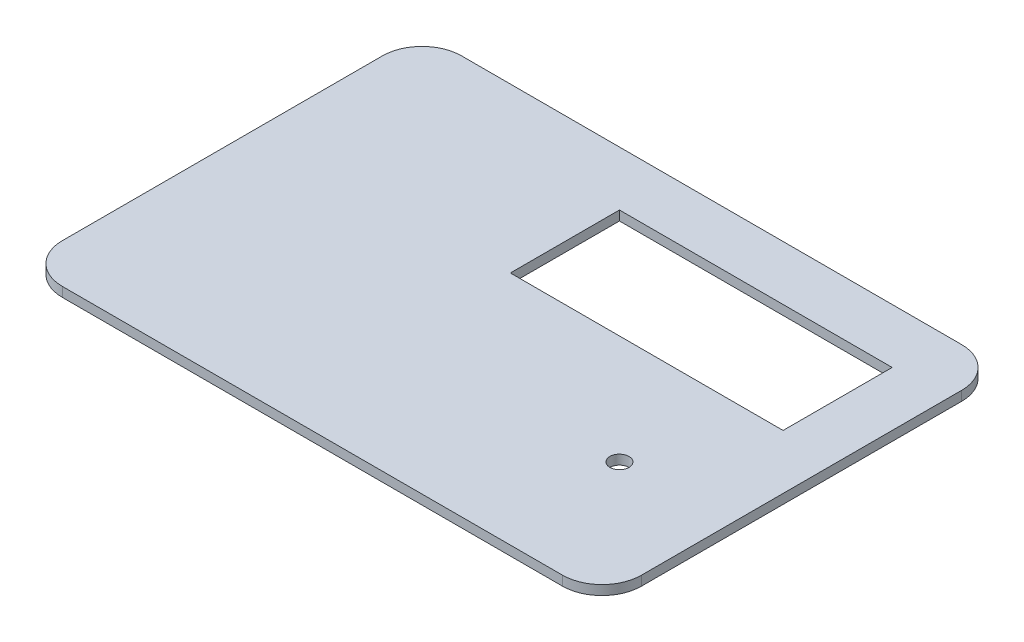
ISO-10303-21;
HEADER;
FILE_DESCRIPTION(('STEP AP214'),'2;1');
FILE_NAME('part.step','',(''),(''),'','','');
FILE_SCHEMA(('AUTOMOTIVE_DESIGN { 1 0 10303 214 1 1 1 1 }'));
ENDSEC;
DATA;
#1=APPLICATION_CONTEXT('core data for automotive mechanical design processes');
#2=APPLICATION_PROTOCOL_DEFINITION('international standard','automotive_design',2000,#1);
#3=PRODUCT_CONTEXT('',#1,'mechanical');
#4=PRODUCT('Part','Part','',(#3));
#5=PRODUCT_RELATED_PRODUCT_CATEGORY('part','',(#4));
#6=PRODUCT_DEFINITION_FORMATION('','',#4);
#7=PRODUCT_DEFINITION_CONTEXT('part definition',#1,'design');
#8=PRODUCT_DEFINITION('design','',#6,#7);
#9=PRODUCT_DEFINITION_SHAPE('','',#8);
#10=(LENGTH_UNIT() NAMED_UNIT(*) SI_UNIT(.MILLI.,.METRE.));
#11=(NAMED_UNIT(*) PLANE_ANGLE_UNIT() SI_UNIT($,.RADIAN.));
#12=(NAMED_UNIT(*) SI_UNIT($,.STERADIAN.) SOLID_ANGLE_UNIT());
#13=UNCERTAINTY_MEASURE_WITH_UNIT(LENGTH_MEASURE(1.E-05),#10,'distance_accuracy_value','');
#14=(GEOMETRIC_REPRESENTATION_CONTEXT(3) GLOBAL_UNCERTAINTY_ASSIGNED_CONTEXT((#13)) GLOBAL_UNIT_ASSIGNED_CONTEXT((#10,
#11,#12)) REPRESENTATION_CONTEXT('',''));
#15=CARTESIAN_POINT('',(0.,0.,0.));
#16=DIRECTION('',(0.,0.,1.));
#17=DIRECTION('',(1.,0.,0.));
#18=AXIS2_PLACEMENT_3D('',#15,#16,#17);
#19=CARTESIAN_POINT('',(91.7,3.5,58.7000000000001));
#20=DIRECTION('',(0.,-1.,0.));
#21=DIRECTION('',(0.,0.,-1.));
#22=AXIS2_PLACEMENT_3D('',#19,#20,#21);
#23=CYLINDRICAL_SURFACE('',#22,14.5);
#24=CARTESIAN_POINT('',(91.7,0.,58.7000000000001));
#25=DIRECTION('',(0.,1.,0.));
#26=DIRECTION('',(0.,0.,1.));
#27=AXIS2_PLACEMENT_3D('',#24,#25,#26);
#28=CIRCLE('',#27,14.5);
#29=CARTESIAN_POINT('',(91.6999999999999,0.,73.2000000000001));
#30=VERTEX_POINT('',#29);
#31=CARTESIAN_POINT('',(106.2,0.,58.7));
#32=VERTEX_POINT('',#31);
#33=EDGE_CURVE('E159',#30,#32,#28,.T.);
#34=ORIENTED_EDGE('',*,*,#33,.T.);
#35=DIRECTION('',(0.,-1.,0.));
#36=VECTOR('',#35,1.);
#37=CARTESIAN_POINT('',(106.2,3.5,58.7));
#38=LINE('',#37,#36);
#39=CARTESIAN_POINT('',(106.2,3.5,58.7));
#40=VERTEX_POINT('',#39);
#41=EDGE_CURVE('E11',#40,#32,#38,.T.);
#42=ORIENTED_EDGE('',*,*,#41,.F.);
#43=CARTESIAN_POINT('',(91.7,3.5,58.7000000000001));
#44=DIRECTION('',(0.,1.,0.));
#45=DIRECTION('',(0.,0.,1.));
#46=AXIS2_PLACEMENT_3D('',#43,#44,#45);
#47=CIRCLE('',#46,14.5);
#48=CARTESIAN_POINT('',(91.6999999999999,3.5,73.2000000000001));
#49=VERTEX_POINT('',#48);
#50=EDGE_CURVE('E168',#49,#40,#47,.T.);
#51=ORIENTED_EDGE('',*,*,#50,.F.);
#52=DIRECTION('',(0.,-1.,0.));
#53=VECTOR('',#52,1.);
#54=CARTESIAN_POINT('',(91.6999999999999,3.5,73.2000000000001));
#55=LINE('',#54,#53);
#56=EDGE_CURVE('E186',#49,#30,#55,.T.);
#57=ORIENTED_EDGE('',*,*,#56,.T.);
#58=EDGE_LOOP('',(#34,#42,#51,#57));
#59=FACE_BOUND('',#58,.T.);
#60=ADVANCED_FACE('F37',(#59),#23,.T.);
#61=CARTESIAN_POINT('',(106.2,3.5,-58.6999999999998));
#62=DIRECTION('',(-1.,0.,0.));
#63=DIRECTION('',(0.,0.,1.));
#64=AXIS2_PLACEMENT_3D('',#61,#62,#63);
#65=PLANE('',#64);
#66=DIRECTION('',(0.,0.,-1.));
#67=VECTOR('',#66,1.);
#68=CARTESIAN_POINT('',(106.2,0.,-58.6999999999998));
#69=LINE('',#68,#67);
#70=CARTESIAN_POINT('',(106.2,0.,-58.6999999999998));
#71=VERTEX_POINT('',#70);
#72=EDGE_CURVE('E189',#32,#71,#69,.T.);
#73=ORIENTED_EDGE('',*,*,#72,.T.);
#74=DIRECTION('',(0.,-1.,0.));
#75=VECTOR('',#74,1.);
#76=CARTESIAN_POINT('',(106.2,3.5,-58.6999999999998));
#77=LINE('',#76,#75);
#78=CARTESIAN_POINT('',(106.2,3.5,-58.6999999999998));
#79=VERTEX_POINT('',#78);
#80=EDGE_CURVE('E44',#79,#71,#77,.T.);
#81=ORIENTED_EDGE('',*,*,#80,.F.);
#82=DIRECTION('',(0.,0.,-1.));
#83=VECTOR('',#82,1.);
#84=CARTESIAN_POINT('',(106.2,3.5,-58.6999999999998));
#85=LINE('',#84,#83);
#86=EDGE_CURVE('E171',#40,#79,#85,.T.);
#87=ORIENTED_EDGE('',*,*,#86,.F.);
#88=ORIENTED_EDGE('',*,*,#41,.T.);
#89=EDGE_LOOP('',(#73,#81,#87,#88));
#90=FACE_BOUND('',#89,.T.);
#91=ADVANCED_FACE('F245',(#90),#65,.F.);
#92=CARTESIAN_POINT('',(91.7,3.5,-58.6999999999999));
#93=DIRECTION('',(0.,-1.,0.));
#94=DIRECTION('',(0.,0.,-1.));
#95=AXIS2_PLACEMENT_3D('',#92,#93,#94);
#96=CYLINDRICAL_SURFACE('',#95,14.5);
#97=CARTESIAN_POINT('',(91.7,0.,-58.6999999999999));
#98=DIRECTION('',(0.,1.,0.));
#99=DIRECTION('',(0.,0.,1.));
#100=AXIS2_PLACEMENT_3D('',#97,#98,#99);
#101=CIRCLE('',#100,14.5);
#102=CARTESIAN_POINT('',(91.6999999999999,0.,-73.1999999999999));
#103=VERTEX_POINT('',#102);
#104=EDGE_CURVE('E191',#71,#103,#101,.T.);
#105=ORIENTED_EDGE('',*,*,#104,.T.);
#106=DIRECTION('',(0.,-1.,0.));
#107=VECTOR('',#106,1.);
#108=CARTESIAN_POINT('',(91.6999999999999,3.5,-73.1999999999999));
#109=LINE('',#108,#107);
#110=CARTESIAN_POINT('',(91.6999999999999,3.5,-73.1999999999999));
#111=VERTEX_POINT('',#110);
#112=EDGE_CURVE('E216',#111,#103,#109,.T.);
#113=ORIENTED_EDGE('',*,*,#112,.F.);
#114=CARTESIAN_POINT('',(91.7,3.5,-58.6999999999999));
#115=DIRECTION('',(0.,1.,0.));
#116=DIRECTION('',(0.,0.,1.));
#117=AXIS2_PLACEMENT_3D('',#114,#115,#116);
#118=CIRCLE('',#117,14.5);
#119=EDGE_CURVE('E174',#79,#111,#118,.T.);
#120=ORIENTED_EDGE('',*,*,#119,.F.);
#121=ORIENTED_EDGE('',*,*,#80,.T.);
#122=EDGE_LOOP('',(#105,#113,#120,#121));
#123=FACE_BOUND('',#122,.T.);
#124=ADVANCED_FACE('F223',(#123),#96,.T.);
#125=CARTESIAN_POINT('',(-91.6999999999999,3.5,-73.1999999999999));
#126=DIRECTION('',(0.,0.,1.));
#127=DIRECTION('',(1.,0.,0.));
#128=AXIS2_PLACEMENT_3D('',#125,#126,#127);
#129=PLANE('',#128);
#130=DIRECTION('',(-1.,0.,0.));
#131=VECTOR('',#130,1.);
#132=CARTESIAN_POINT('',(-91.6999999999999,0.,-73.1999999999999));
#133=LINE('',#132,#131);
#134=CARTESIAN_POINT('',(-91.7,0.,-73.1999999999999));
#135=VERTEX_POINT('',#134);
#136=EDGE_CURVE('E193',#103,#135,#133,.T.);
#137=ORIENTED_EDGE('',*,*,#136,.T.);
#138=DIRECTION('',(0.,-1.,0.));
#139=VECTOR('',#138,1.);
#140=CARTESIAN_POINT('',(-91.7,3.5,-73.1999999999999));
#141=LINE('',#140,#139);
#142=CARTESIAN_POINT('',(-91.7,3.5,-73.1999999999999));
#143=VERTEX_POINT('',#142);
#144=EDGE_CURVE('E213',#143,#135,#141,.T.);
#145=ORIENTED_EDGE('',*,*,#144,.F.);
#146=DIRECTION('',(-1.,0.,0.));
#147=VECTOR('',#146,1.);
#148=CARTESIAN_POINT('',(-91.6999999999999,3.5,-73.1999999999999));
#149=LINE('',#148,#147);
#150=EDGE_CURVE('E176',#111,#143,#149,.T.);
#151=ORIENTED_EDGE('',*,*,#150,.F.);
#152=ORIENTED_EDGE('',*,*,#112,.T.);
#153=EDGE_LOOP('',(#137,#145,#151,#152));
#154=FACE_BOUND('',#153,.T.);
#155=ADVANCED_FACE('F233',(#154),#129,.F.);
#156=CARTESIAN_POINT('',(-91.7,3.5,-58.6999999999999));
#157=DIRECTION('',(0.,-1.,0.));
#158=DIRECTION('',(0.,0.,-1.));
#159=AXIS2_PLACEMENT_3D('',#156,#157,#158);
#160=CYLINDRICAL_SURFACE('',#159,14.5);
#161=CARTESIAN_POINT('',(-91.7,0.,-58.6999999999999));
#162=DIRECTION('',(0.,1.,0.));
#163=DIRECTION('',(0.,0.,-1.));
#164=AXIS2_PLACEMENT_3D('',#161,#162,#163);
#165=CIRCLE('',#164,14.5);
#166=CARTESIAN_POINT('',(-106.2,0.,-58.6999999999998));
#167=VERTEX_POINT('',#166);
#168=EDGE_CURVE('E195',#135,#167,#165,.T.);
#169=ORIENTED_EDGE('',*,*,#168,.T.);
#170=DIRECTION('',(0.,-1.,0.));
#171=VECTOR('',#170,1.);
#172=CARTESIAN_POINT('',(-106.2,3.5,-58.6999999999998));
#173=LINE('',#172,#171);
#174=CARTESIAN_POINT('',(-106.2,3.5,-58.6999999999998));
#175=VERTEX_POINT('',#174);
#176=EDGE_CURVE('E210',#175,#167,#173,.T.);
#177=ORIENTED_EDGE('',*,*,#176,.F.);
#178=CARTESIAN_POINT('',(-91.7,3.5,-58.6999999999999));
#179=DIRECTION('',(0.,1.,0.));
#180=DIRECTION('',(0.,0.,-1.));
#181=AXIS2_PLACEMENT_3D('',#178,#179,#180);
#182=CIRCLE('',#181,14.5);
#183=EDGE_CURVE('E178',#143,#175,#182,.T.);
#184=ORIENTED_EDGE('',*,*,#183,.F.);
#185=ORIENTED_EDGE('',*,*,#144,.T.);
#186=EDGE_LOOP('',(#169,#177,#184,#185));
#187=FACE_BOUND('',#186,.T.);
#188=ADVANCED_FACE('F237',(#187),#160,.T.);
#189=CARTESIAN_POINT('',(-106.2,3.5,-58.6999999999998));
#190=DIRECTION('',(1.,0.,0.));
#191=DIRECTION('',(0.,0.,-1.));
#192=AXIS2_PLACEMENT_3D('',#189,#190,#191);
#193=PLANE('',#192);
#194=DIRECTION('',(0.,0.,1.));
#195=VECTOR('',#194,1.);
#196=CARTESIAN_POINT('',(-106.2,0.,-58.6999999999998));
#197=LINE('',#196,#195);
#198=CARTESIAN_POINT('',(-106.2,0.,58.7));
#199=VERTEX_POINT('',#198);
#200=EDGE_CURVE('E197',#167,#199,#197,.T.);
#201=ORIENTED_EDGE('',*,*,#200,.T.);
#202=DIRECTION('',(0.,-1.,0.));
#203=VECTOR('',#202,1.);
#204=CARTESIAN_POINT('',(-106.2,3.5,58.7));
#205=LINE('',#204,#203);
#206=CARTESIAN_POINT('',(-106.2,3.5,58.7));
#207=VERTEX_POINT('',#206);
#208=EDGE_CURVE('E207',#207,#199,#205,.T.);
#209=ORIENTED_EDGE('',*,*,#208,.F.);
#210=DIRECTION('',(0.,0.,1.));
#211=VECTOR('',#210,1.);
#212=CARTESIAN_POINT('',(-106.2,3.5,-58.6999999999998));
#213=LINE('',#212,#211);
#214=EDGE_CURVE('E180',#175,#207,#213,.T.);
#215=ORIENTED_EDGE('',*,*,#214,.F.);
#216=ORIENTED_EDGE('',*,*,#176,.T.);
#217=EDGE_LOOP('',(#201,#209,#215,#216));
#218=FACE_BOUND('',#217,.T.);
#219=ADVANCED_FACE('F258',(#218),#193,.F.);
#220=CARTESIAN_POINT('',(-91.7,3.5,58.7000000000001));
#221=DIRECTION('',(0.,-1.,0.));
#222=DIRECTION('',(0.,0.,-1.));
#223=AXIS2_PLACEMENT_3D('',#220,#221,#222);
#224=CYLINDRICAL_SURFACE('',#223,14.5);
#225=CARTESIAN_POINT('',(-91.7,0.,58.7000000000001));
#226=DIRECTION('',(0.,1.,0.));
#227=DIRECTION('',(0.,0.,1.));
#228=AXIS2_PLACEMENT_3D('',#225,#226,#227);
#229=CIRCLE('',#228,14.5);
#230=CARTESIAN_POINT('',(-91.6999999999999,0.,73.2000000000001));
#231=VERTEX_POINT('',#230);
#232=EDGE_CURVE('E199',#199,#231,#229,.T.);
#233=ORIENTED_EDGE('',*,*,#232,.T.);
#234=DIRECTION('',(0.,-1.,0.));
#235=VECTOR('',#234,1.);
#236=CARTESIAN_POINT('',(-91.6999999999999,3.5,73.2000000000001));
#237=LINE('',#236,#235);
#238=CARTESIAN_POINT('',(-91.6999999999999,3.5,73.2000000000001));
#239=VERTEX_POINT('',#238);
#240=EDGE_CURVE('E204',#239,#231,#237,.T.);
#241=ORIENTED_EDGE('',*,*,#240,.F.);
#242=CARTESIAN_POINT('',(-91.7,3.5,58.7000000000001));
#243=DIRECTION('',(0.,1.,0.));
#244=DIRECTION('',(0.,0.,1.));
#245=AXIS2_PLACEMENT_3D('',#242,#243,#244);
#246=CIRCLE('',#245,14.5);
#247=EDGE_CURVE('E182',#207,#239,#246,.T.);
#248=ORIENTED_EDGE('',*,*,#247,.F.);
#249=ORIENTED_EDGE('',*,*,#208,.T.);
#250=EDGE_LOOP('',(#233,#241,#248,#249));
#251=FACE_BOUND('',#250,.T.);
#252=ADVANCED_FACE('F256',(#251),#224,.T.);
#253=CARTESIAN_POINT('',(-91.6999999999999,3.5,73.2000000000001));
#254=DIRECTION('',(0.,0.,-1.));
#255=DIRECTION('',(-1.,0.,0.));
#256=AXIS2_PLACEMENT_3D('',#253,#254,#255);
#257=PLANE('',#256);
#258=DIRECTION('',(1.,0.,0.));
#259=VECTOR('',#258,1.);
#260=CARTESIAN_POINT('',(-91.6999999999999,0.,73.2000000000001));
#261=LINE('',#260,#259);
#262=EDGE_CURVE('E172',#231,#30,#261,.T.);
#263=ORIENTED_EDGE('',*,*,#262,.T.);
#264=ORIENTED_EDGE('',*,*,#56,.F.);
#265=DIRECTION('',(1.,0.,0.));
#266=VECTOR('',#265,1.);
#267=CARTESIAN_POINT('',(-91.6999999999999,3.5,73.2000000000001));
#268=LINE('',#267,#266);
#269=EDGE_CURVE('E184',#239,#49,#268,.T.);
#270=ORIENTED_EDGE('',*,*,#269,.F.);
#271=ORIENTED_EDGE('',*,*,#240,.T.);
#272=EDGE_LOOP('',(#263,#264,#270,#271));
#273=FACE_BOUND('',#272,.T.);
#274=ADVANCED_FACE('F251',(#273),#257,.F.);
#275=CARTESIAN_POINT('',(91.7,3.5,58.7000000000001));
#276=DIRECTION('',(0.,1.,0.));
#277=DIRECTION('',(0.,0.,1.));
#278=AXIS2_PLACEMENT_3D('',#275,#276,#277);
#279=PLANE('',#278);
#280=DIRECTION('',(0.,0.,1.));
#281=VECTOR('',#280,1.);
#282=CARTESIAN_POINT('',(-13.8,3.5,-53.1999999999999));
#283=LINE('',#282,#281);
#284=CARTESIAN_POINT('',(-13.8,3.5,-53.1999999999999));
#285=VERTEX_POINT('',#284);
#286=CARTESIAN_POINT('',(-13.8,3.5,-13.1999999999999));
#287=VERTEX_POINT('',#286);
#288=EDGE_CURVE('E51',#285,#287,#283,.T.);
#289=ORIENTED_EDGE('',*,*,#288,.F.);
#290=DIRECTION('',(-1.,0.,0.));
#291=VECTOR('',#290,1.);
#292=CARTESIAN_POINT('',(-13.8,3.5,-53.1999999999999));
#293=LINE('',#292,#291);
#294=CARTESIAN_POINT('',(86.2,3.5,-53.1999999999999));
#295=VERTEX_POINT('',#294);
#296=EDGE_CURVE('E143',#295,#285,#293,.T.);
#297=ORIENTED_EDGE('',*,*,#296,.F.);
#298=DIRECTION('',(0.,0.,-1.));
#299=VECTOR('',#298,1.);
#300=CARTESIAN_POINT('',(86.2,3.5,-53.1999999999999));
#301=LINE('',#300,#299);
#302=CARTESIAN_POINT('',(86.2,3.5,-13.1999999999999));
#303=VERTEX_POINT('',#302);
#304=EDGE_CURVE('E146',#303,#295,#301,.T.);
#305=ORIENTED_EDGE('',*,*,#304,.F.);
#306=DIRECTION('',(1.,0.,0.));
#307=VECTOR('',#306,1.);
#308=CARTESIAN_POINT('',(-13.8,3.5,-13.1999999999999));
#309=LINE('',#308,#307);
#310=EDGE_CURVE('E152',#287,#303,#309,.T.);
#311=ORIENTED_EDGE('',*,*,#310,.F.);
#312=EDGE_LOOP('',(#289,#297,#305,#311));
#313=FACE_BOUND('',#312,.T.);
#314=CARTESIAN_POINT('',(66.2,3.5,26.8000000000001));
#315=DIRECTION('',(0.,1.,0.));
#316=DIRECTION('',(0.,0.,1.));
#317=AXIS2_PLACEMENT_3D('',#314,#315,#316);
#318=CIRCLE('',#317,3.50000000000001);
#319=CARTESIAN_POINT('',(66.2,3.5,30.3000000000001));
#320=VERTEX_POINT('',#319);
#321=EDGE_CURVE('E153',#320,#320,#318,.T.);
#322=ORIENTED_EDGE('',*,*,#321,.F.);
#323=EDGE_LOOP('',(#322));
#324=FACE_BOUND('',#323,.T.);
#325=ORIENTED_EDGE('',*,*,#50,.T.);
#326=ORIENTED_EDGE('',*,*,#86,.T.);
#327=ORIENTED_EDGE('',*,*,#119,.T.);
#328=ORIENTED_EDGE('',*,*,#150,.T.);
#329=ORIENTED_EDGE('',*,*,#183,.T.);
#330=ORIENTED_EDGE('',*,*,#214,.T.);
#331=ORIENTED_EDGE('',*,*,#247,.T.);
#332=ORIENTED_EDGE('',*,*,#269,.T.);
#333=EDGE_LOOP('',(#325,#326,#327,#328,#329,#330,#331,#332));
#334=FACE_BOUND('',#333,.T.);
#335=ADVANCED_FACE('F241',(#313,#324,#334),#279,.T.);
#336=CARTESIAN_POINT('',(91.7,0.,58.7000000000001));
#337=DIRECTION('',(0.,1.,0.));
#338=DIRECTION('',(0.,0.,1.));
#339=AXIS2_PLACEMENT_3D('',#336,#337,#338);
#340=PLANE('',#339);
#341=DIRECTION('',(-1.,0.,0.));
#342=VECTOR('',#341,1.);
#343=CARTESIAN_POINT('',(-13.8,0.,-53.1999999999999));
#344=LINE('',#343,#342);
#345=CARTESIAN_POINT('',(86.2,0.,-53.1999999999999));
#346=VERTEX_POINT('',#345);
#347=CARTESIAN_POINT('',(-13.8,0.,-53.1999999999999));
#348=VERTEX_POINT('',#347);
#349=EDGE_CURVE('E133',#346,#348,#344,.T.);
#350=ORIENTED_EDGE('',*,*,#349,.T.);
#351=DIRECTION('',(0.,0.,1.));
#352=VECTOR('',#351,1.);
#353=CARTESIAN_POINT('',(-13.8,0.,-53.1999999999999));
#354=LINE('',#353,#352);
#355=CARTESIAN_POINT('',(-13.8,0.,-13.1999999999999));
#356=VERTEX_POINT('',#355);
#357=EDGE_CURVE('E127',#348,#356,#354,.T.);
#358=ORIENTED_EDGE('',*,*,#357,.T.);
#359=DIRECTION('',(1.,0.,0.));
#360=VECTOR('',#359,1.);
#361=CARTESIAN_POINT('',(-13.8,0.,-13.1999999999999));
#362=LINE('',#361,#360);
#363=CARTESIAN_POINT('',(86.2,0.,-13.1999999999999));
#364=VERTEX_POINT('',#363);
#365=EDGE_CURVE('E136',#356,#364,#362,.T.);
#366=ORIENTED_EDGE('',*,*,#365,.T.);
#367=DIRECTION('',(0.,0.,-1.));
#368=VECTOR('',#367,1.);
#369=CARTESIAN_POINT('',(86.2,0.,-53.1999999999999));
#370=LINE('',#369,#368);
#371=EDGE_CURVE('E59',#364,#346,#370,.T.);
#372=ORIENTED_EDGE('',*,*,#371,.T.);
#373=EDGE_LOOP('',(#350,#358,#366,#372));
#374=FACE_BOUND('',#373,.T.);
#375=CARTESIAN_POINT('',(66.2,0.,26.8000000000001));
#376=DIRECTION('',(0.,1.,0.));
#377=DIRECTION('',(0.,0.,1.));
#378=AXIS2_PLACEMENT_3D('',#375,#376,#377);
#379=CIRCLE('',#378,3.50000000000001);
#380=CARTESIAN_POINT('',(66.2,0.,30.3000000000001));
#381=VERTEX_POINT('',#380);
#382=EDGE_CURVE('E165',#381,#381,#379,.T.);
#383=ORIENTED_EDGE('',*,*,#382,.T.);
#384=EDGE_LOOP('',(#383));
#385=FACE_BOUND('',#384,.T.);
#386=ORIENTED_EDGE('',*,*,#33,.F.);
#387=ORIENTED_EDGE('',*,*,#262,.F.);
#388=ORIENTED_EDGE('',*,*,#232,.F.);
#389=ORIENTED_EDGE('',*,*,#200,.F.);
#390=ORIENTED_EDGE('',*,*,#168,.F.);
#391=ORIENTED_EDGE('',*,*,#136,.F.);
#392=ORIENTED_EDGE('',*,*,#104,.F.);
#393=ORIENTED_EDGE('',*,*,#72,.F.);
#394=EDGE_LOOP('',(#386,#387,#388,#389,#390,#391,#392,#393));
#395=FACE_BOUND('',#394,.T.);
#396=ADVANCED_FACE('F140',(#374,#385,#395),#340,.F.);
#397=CARTESIAN_POINT('',(66.2,0.,26.8000000000001));
#398=DIRECTION('',(0.,1.,0.));
#399=DIRECTION('',(0.,0.,1.));
#400=AXIS2_PLACEMENT_3D('',#397,#398,#399);
#401=CYLINDRICAL_SURFACE('',#400,3.50000000000001);
#402=ORIENTED_EDGE('',*,*,#382,.F.);
#403=EDGE_LOOP('',(#402));
#404=FACE_BOUND('',#403,.T.);
#405=ORIENTED_EDGE('',*,*,#321,.T.);
#406=EDGE_LOOP('',(#405));
#407=FACE_BOUND('',#406,.T.);
#408=ADVANCED_FACE('F326',(#404,#407),#401,.F.);
#409=CARTESIAN_POINT('',(-13.8,0.,-53.1999999999999));
#410=DIRECTION('',(-1.,0.,0.));
#411=DIRECTION('',(0.,0.,1.));
#412=AXIS2_PLACEMENT_3D('',#409,#410,#411);
#413=PLANE('',#412);
#414=ORIENTED_EDGE('',*,*,#288,.T.);
#415=DIRECTION('',(0.,1.,0.));
#416=VECTOR('',#415,1.);
#417=CARTESIAN_POINT('',(-13.8,0.,-13.1999999999999));
#418=LINE('',#417,#416);
#419=EDGE_CURVE('E123',#356,#287,#418,.T.);
#420=ORIENTED_EDGE('',*,*,#419,.F.);
#421=ORIENTED_EDGE('',*,*,#357,.F.);
#422=DIRECTION('',(0.,1.,0.));
#423=VECTOR('',#422,1.);
#424=CARTESIAN_POINT('',(-13.8,0.,-53.1999999999999));
#425=LINE('',#424,#423);
#426=EDGE_CURVE('E157',#348,#285,#425,.T.);
#427=ORIENTED_EDGE('',*,*,#426,.T.);
#428=EDGE_LOOP('',(#414,#420,#421,#427));
#429=FACE_BOUND('',#428,.T.);
#430=ADVANCED_FACE('F125',(#429),#413,.F.);
#431=CARTESIAN_POINT('',(-13.8,0.,-53.1999999999999));
#432=DIRECTION('',(0.,0.,-1.));
#433=DIRECTION('',(-1.,0.,0.));
#434=AXIS2_PLACEMENT_3D('',#431,#432,#433);
#435=PLANE('',#434);
#436=ORIENTED_EDGE('',*,*,#296,.T.);
#437=ORIENTED_EDGE('',*,*,#426,.F.);
#438=ORIENTED_EDGE('',*,*,#349,.F.);
#439=DIRECTION('',(0.,1.,0.));
#440=VECTOR('',#439,1.);
#441=CARTESIAN_POINT('',(86.2,0.,-53.1999999999999));
#442=LINE('',#441,#440);
#443=EDGE_CURVE('E160',#346,#295,#442,.T.);
#444=ORIENTED_EDGE('',*,*,#443,.T.);
#445=EDGE_LOOP('',(#436,#437,#438,#444));
#446=FACE_BOUND('',#445,.T.);
#447=ADVANCED_FACE('F346',(#446),#435,.F.);
#448=CARTESIAN_POINT('',(86.2,0.,-53.1999999999999));
#449=DIRECTION('',(1.,0.,0.));
#450=DIRECTION('',(0.,0.,-1.));
#451=AXIS2_PLACEMENT_3D('',#448,#449,#450);
#452=PLANE('',#451);
#453=ORIENTED_EDGE('',*,*,#304,.T.);
#454=ORIENTED_EDGE('',*,*,#443,.F.);
#455=ORIENTED_EDGE('',*,*,#371,.F.);
#456=DIRECTION('',(0.,1.,0.));
#457=VECTOR('',#456,1.);
#458=CARTESIAN_POINT('',(86.2,0.,-13.1999999999999));
#459=LINE('',#458,#457);
#460=EDGE_CURVE('E132',#364,#303,#459,.T.);
#461=ORIENTED_EDGE('',*,*,#460,.T.);
#462=EDGE_LOOP('',(#453,#454,#455,#461));
#463=FACE_BOUND('',#462,.T.);
#464=ADVANCED_FACE('F356',(#463),#452,.F.);
#465=CARTESIAN_POINT('',(-13.8,0.,-13.1999999999999));
#466=DIRECTION('',(0.,0.,1.));
#467=DIRECTION('',(1.,0.,0.));
#468=AXIS2_PLACEMENT_3D('',#465,#466,#467);
#469=PLANE('',#468);
#470=ORIENTED_EDGE('',*,*,#310,.T.);
#471=ORIENTED_EDGE('',*,*,#460,.F.);
#472=ORIENTED_EDGE('',*,*,#365,.F.);
#473=ORIENTED_EDGE('',*,*,#419,.T.);
#474=EDGE_LOOP('',(#470,#471,#472,#473));
#475=FACE_BOUND('',#474,.T.);
#476=ADVANCED_FACE('F137',(#475),#469,.F.);
#477=CLOSED_SHELL('',(#60,#91,#124,#155,#188,#219,#252,#274,#335,#396,#408,#430,#447,#464,#476));
#478=MANIFOLD_SOLID_BREP('B2',#477);
#479=ADVANCED_BREP_SHAPE_REPRESENTATION('',(#18,#478),#14);
#480=SHAPE_DEFINITION_REPRESENTATION(#9,#479);
ENDSEC;
END-ISO-10303-21;
